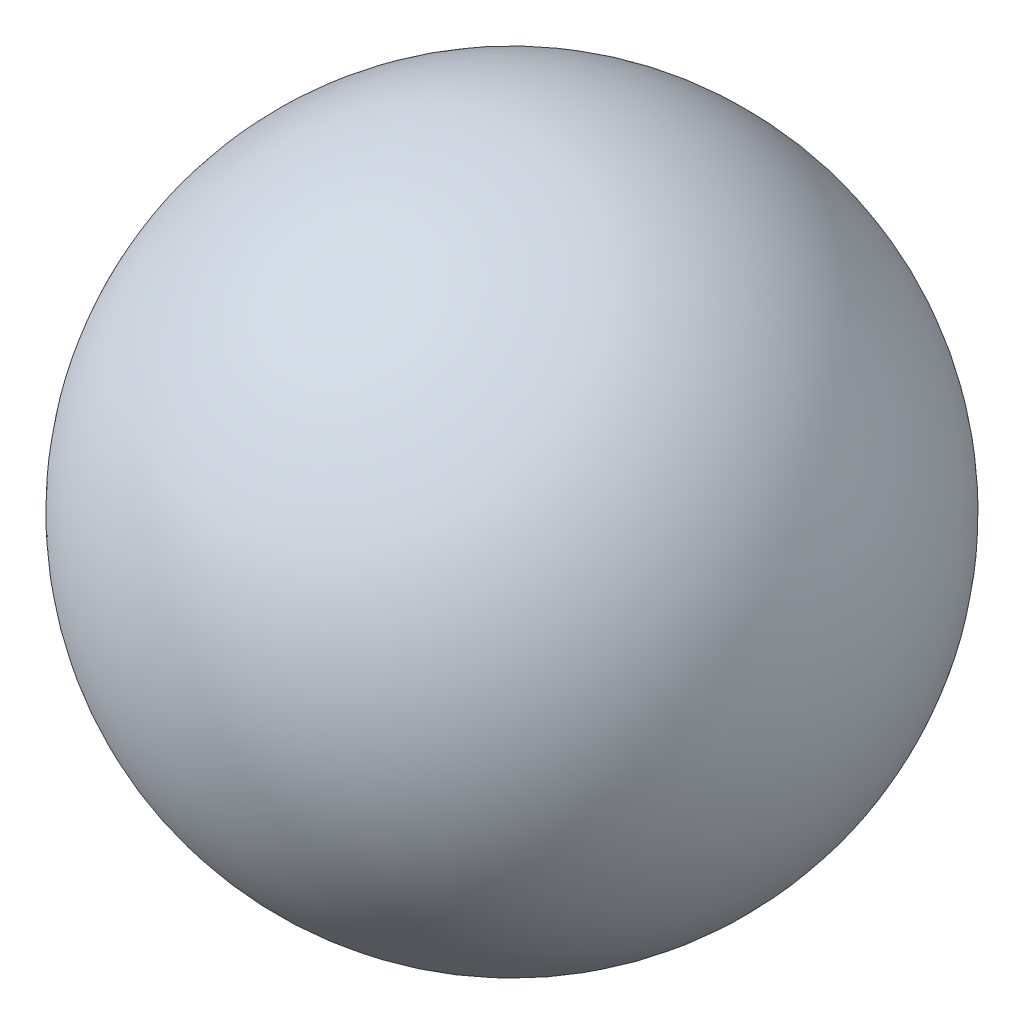
ISO-10303-21;
HEADER;
FILE_DESCRIPTION(('STEP AP214'),'2;1');
FILE_NAME('part.step','',(''),(''),'','','');
FILE_SCHEMA(('AUTOMOTIVE_DESIGN { 1 0 10303 214 1 1 1 1 }'));
ENDSEC;
DATA;
#1=APPLICATION_CONTEXT('core data for automotive mechanical design processes');
#2=APPLICATION_PROTOCOL_DEFINITION('international standard','automotive_design',2000,#1);
#3=PRODUCT_CONTEXT('',#1,'mechanical');
#4=PRODUCT('Part','Part','',(#3));
#5=PRODUCT_RELATED_PRODUCT_CATEGORY('part','',(#4));
#6=PRODUCT_DEFINITION_FORMATION('','',#4);
#7=PRODUCT_DEFINITION_CONTEXT('part definition',#1,'design');
#8=PRODUCT_DEFINITION('design','',#6,#7);
#9=PRODUCT_DEFINITION_SHAPE('','',#8);
#10=(LENGTH_UNIT() NAMED_UNIT(*) SI_UNIT(.MILLI.,.METRE.));
#11=(NAMED_UNIT(*) PLANE_ANGLE_UNIT() SI_UNIT($,.RADIAN.));
#12=(NAMED_UNIT(*) SI_UNIT($,.STERADIAN.) SOLID_ANGLE_UNIT());
#13=UNCERTAINTY_MEASURE_WITH_UNIT(LENGTH_MEASURE(1.E-05),#10,'distance_accuracy_value','');
#14=(GEOMETRIC_REPRESENTATION_CONTEXT(3) GLOBAL_UNCERTAINTY_ASSIGNED_CONTEXT((#13)) GLOBAL_UNIT_ASSIGNED_CONTEXT((#10,
#11,#12)) REPRESENTATION_CONTEXT('',''));
#15=CARTESIAN_POINT('',(0.,0.,0.));
#16=DIRECTION('',(0.,0.,1.));
#17=DIRECTION('',(1.,0.,0.));
#18=AXIS2_PLACEMENT_3D('',#15,#16,#17);
#19=CARTESIAN_POINT('',(-0.0824066517037333,0.,0.));
#20=DIRECTION('',(-1.,0.,0.));
#21=DIRECTION('',(0.,1.,0.));
#22=AXIS2_PLACEMENT_3D('',#19,#20,#21);
#23=SPHERICAL_SURFACE('',#22,2.25);
#24=CARTESIAN_POINT('',(-2.33240665170373,0.,0.));
#25=VERTEX_POINT('',#24);
#26=VERTEX_LOOP('',#25);
#27=FACE_BOUND('',#26,.T.);
#28=ADVANCED_FACE('F33',(#27),#23,.T.);
#29=CLOSED_SHELL('',(#28));
#30=MANIFOLD_SOLID_BREP('B2',#29);
#31=ADVANCED_BREP_SHAPE_REPRESENTATION('',(#18,#30),#14);
#32=SHAPE_DEFINITION_REPRESENTATION(#9,#31);
ENDSEC;
END-ISO-10303-21;
